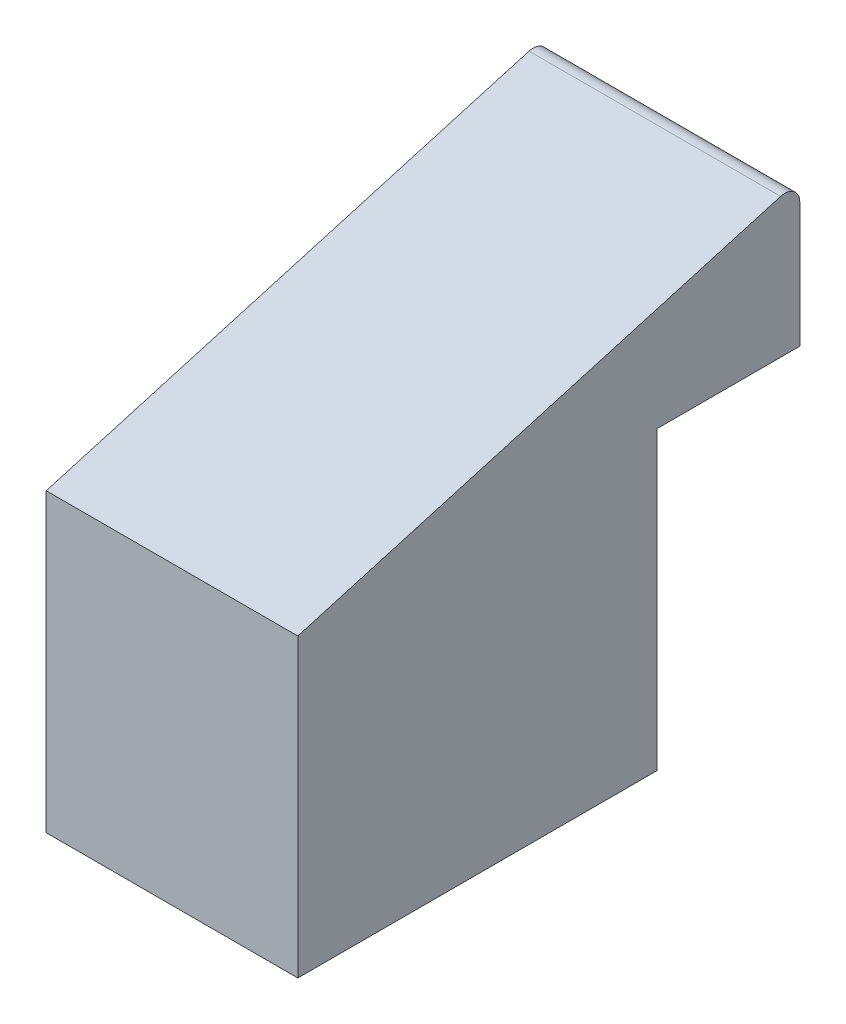
ISO-10303-21;
HEADER;
FILE_DESCRIPTION(('STEP AP214'),'2;1');
FILE_NAME('part.step','',(''),(''),'','','');
FILE_SCHEMA(('AUTOMOTIVE_DESIGN { 1 0 10303 214 1 1 1 1 }'));
ENDSEC;
DATA;
#1=APPLICATION_CONTEXT('core data for automotive mechanical design processes');
#2=APPLICATION_PROTOCOL_DEFINITION('international standard','automotive_design',2000,#1);
#3=PRODUCT_CONTEXT('',#1,'mechanical');
#4=PRODUCT('Part','Part','',(#3));
#5=PRODUCT_RELATED_PRODUCT_CATEGORY('part','',(#4));
#6=PRODUCT_DEFINITION_FORMATION('','',#4);
#7=PRODUCT_DEFINITION_CONTEXT('part definition',#1,'design');
#8=PRODUCT_DEFINITION('design','',#6,#7);
#9=PRODUCT_DEFINITION_SHAPE('','',#8);
#10=(LENGTH_UNIT() NAMED_UNIT(*) SI_UNIT(.MILLI.,.METRE.));
#11=(NAMED_UNIT(*) PLANE_ANGLE_UNIT() SI_UNIT($,.RADIAN.));
#12=(NAMED_UNIT(*) SI_UNIT($,.STERADIAN.) SOLID_ANGLE_UNIT());
#13=UNCERTAINTY_MEASURE_WITH_UNIT(LENGTH_MEASURE(1.E-05),#10,'distance_accuracy_value','');
#14=(GEOMETRIC_REPRESENTATION_CONTEXT(3) GLOBAL_UNCERTAINTY_ASSIGNED_CONTEXT((#13)) GLOBAL_UNIT_ASSIGNED_CONTEXT((#10,
#11,#12)) REPRESENTATION_CONTEXT('',''));
#15=CARTESIAN_POINT('',(0.,0.,0.));
#16=DIRECTION('',(0.,0.,1.));
#17=DIRECTION('',(1.,0.,0.));
#18=AXIS2_PLACEMENT_3D('',#15,#16,#17);
#19=CARTESIAN_POINT('',(9.60524066896878,-12.8758220709134,13.362378783161));
#20=DIRECTION('',(0.,0.,1.));
#21=DIRECTION('',(1.,0.,0.));
#22=AXIS2_PLACEMENT_3D('',#19,#20,#21);
#23=PLANE('',#22);
#24=DIRECTION('',(0.,-1.,0.));
#25=VECTOR('',#24,1.);
#26=CARTESIAN_POINT('',(9.85924066896878,-12.8758220709134,13.362378783161));
#27=LINE('',#26,#25);
#28=CARTESIAN_POINT('',(9.85924066896878,-12.8758220709134,13.362378783161));
#29=VERTEX_POINT('',#28);
#30=CARTESIAN_POINT('',(9.85924066896878,-15.3881327229248,13.362378783161));
#31=VERTEX_POINT('',#30);
#32=EDGE_CURVE('E66',#29,#31,#27,.T.);
#33=ORIENTED_EDGE('',*,*,#32,.T.);
#34=DIRECTION('',(1.,0.,0.));
#35=VECTOR('',#34,1.);
#36=CARTESIAN_POINT('',(-18.7402642661104,-15.3881327229248,13.362378783161));
#37=LINE('',#36,#35);
#38=CARTESIAN_POINT('',(9.60524066896878,-15.3881327229248,13.362378783161));
#39=VERTEX_POINT('',#38);
#40=EDGE_CURVE('E147',#39,#31,#37,.T.);
#41=ORIENTED_EDGE('',*,*,#40,.F.);
#42=DIRECTION('',(0.,-1.,0.));
#43=VECTOR('',#42,1.);
#44=CARTESIAN_POINT('',(9.60524066896878,-12.8758220709134,13.362378783161));
#45=LINE('',#44,#43);
#46=CARTESIAN_POINT('',(9.60524066896878,-12.8758220709134,13.362378783161));
#47=VERTEX_POINT('',#46);
#48=EDGE_CURVE('E164',#47,#39,#45,.T.);
#49=ORIENTED_EDGE('',*,*,#48,.F.);
#50=DIRECTION('',(-1.,0.,0.));
#51=VECTOR('',#50,1.);
#52=CARTESIAN_POINT('',(9.60524066896878,-12.8758220709134,13.362378783161));
#53=LINE('',#52,#51);
#54=EDGE_CURVE('E163',#29,#47,#53,.T.);
#55=ORIENTED_EDGE('',*,*,#54,.F.);
#56=EDGE_LOOP('',(#33,#41,#49,#55));
#57=FACE_BOUND('',#56,.T.);
#58=ADVANCED_FACE('F41',(#57),#23,.F.);
#59=CARTESIAN_POINT('',(5.18492778377403,-12.8758220709134,12.1523689889276));
#60=DIRECTION('',(0.,0.,-1.));
#61=DIRECTION('',(-1.,0.,0.));
#62=AXIS2_PLACEMENT_3D('',#59,#60,#61);
#63=PLANE('',#62);
#64=DIRECTION('',(1.,0.,0.));
#65=VECTOR('',#64,1.);
#66=CARTESIAN_POINT('',(5.18492778377403,-11.9115475959494,12.1523689889276));
#67=LINE('',#66,#65);
#68=CARTESIAN_POINT('',(9.85924066896878,-11.9115475959494,12.1523689889276));
#69=VERTEX_POINT('',#68);
#70=CARTESIAN_POINT('',(11.4857357338896,-11.9115475959494,12.1523689889276));
#71=VERTEX_POINT('',#70);
#72=EDGE_CURVE('E233',#69,#71,#67,.T.);
#73=ORIENTED_EDGE('',*,*,#72,.F.);
#74=DIRECTION('',(0.,-1.,0.));
#75=VECTOR('',#74,1.);
#76=CARTESIAN_POINT('',(9.85924066896878,-12.8758220709134,12.1523689889276));
#77=LINE('',#76,#75);
#78=CARTESIAN_POINT('',(9.85924066896878,-12.8758220709134,12.1523689889276));
#79=VERTEX_POINT('',#78);
#80=EDGE_CURVE('E237',#69,#79,#77,.T.);
#81=ORIENTED_EDGE('',*,*,#80,.T.);
#82=DIRECTION('',(1.,0.,0.));
#83=VECTOR('',#82,1.);
#84=CARTESIAN_POINT('',(5.18492778377403,-12.8758220709134,12.1523689889276));
#85=LINE('',#84,#83);
#86=CARTESIAN_POINT('',(9.60524066896878,-12.8758220709134,12.1523689889276));
#87=VERTEX_POINT('',#86);
#88=EDGE_CURVE('E187',#87,#79,#85,.T.);
#89=ORIENTED_EDGE('',*,*,#88,.F.);
#90=DIRECTION('',(0.,-1.,0.));
#91=VECTOR('',#90,1.);
#92=CARTESIAN_POINT('',(9.60524066896878,-12.8758220709134,12.1523689889276));
#93=LINE('',#92,#91);
#94=CARTESIAN_POINT('',(9.60524066896878,-11.8160118100752,12.1523689889276));
#95=VERTEX_POINT('',#94);
#96=EDGE_CURVE('E198',#95,#87,#93,.T.);
#97=ORIENTED_EDGE('',*,*,#96,.F.);
#98=DIRECTION('',(1.,0.,0.));
#99=VECTOR('',#98,1.);
#100=CARTESIAN_POINT('',(5.18492778377403,-11.8160118100752,12.1523689889276));
#101=LINE('',#100,#99);
#102=CARTESIAN_POINT('',(11.7397357338896,-11.8160118100752,12.1523689889276));
#103=VERTEX_POINT('',#102);
#104=EDGE_CURVE('E191',#95,#103,#101,.T.);
#105=ORIENTED_EDGE('',*,*,#104,.T.);
#106=DIRECTION('',(0.,1.,0.));
#107=VECTOR('',#106,1.);
#108=CARTESIAN_POINT('',(11.7397357338896,-12.8758220709134,12.1523689889276));
#109=LINE('',#108,#107);
#110=CARTESIAN_POINT('',(11.7397357338896,-12.8758220709134,12.1523689889276));
#111=VERTEX_POINT('',#110);
#112=EDGE_CURVE('E203',#111,#103,#109,.T.);
#113=ORIENTED_EDGE('',*,*,#112,.F.);
#114=CARTESIAN_POINT('',(11.4857357338896,-12.8758220709134,12.1523689889276));
#115=VERTEX_POINT('',#114);
#116=EDGE_CURVE('E192',#115,#111,#85,.T.);
#117=ORIENTED_EDGE('',*,*,#116,.F.);
#118=DIRECTION('',(0.,1.,0.));
#119=VECTOR('',#118,1.);
#120=CARTESIAN_POINT('',(11.4857357338896,-12.8758220709134,12.1523689889276));
#121=LINE('',#120,#119);
#122=EDGE_CURVE('E228',#115,#71,#121,.T.);
#123=ORIENTED_EDGE('',*,*,#122,.T.);
#124=EDGE_LOOP('',(#73,#81,#89,#97,#105,#113,#117,#123));
#125=FACE_BOUND('',#124,.T.);
#126=ADVANCED_FACE('F294',(#125),#63,.T.);
#127=CARTESIAN_POINT('',(5.18492778377403,-12.8758220709134,16.410378783161));
#128=DIRECTION('',(0.,-1.,0.));
#129=DIRECTION('',(0.,0.,-1.));
#130=AXIS2_PLACEMENT_3D('',#127,#128,#129);
#131=PLANE('',#130);
#132=CARTESIAN_POINT('',(11.7397357338896,-12.8758220709134,13.362378783161));
#133=VERTEX_POINT('',#132);
#134=CARTESIAN_POINT('',(11.4857357338896,-12.8758220709134,13.362378783161));
#135=VERTEX_POINT('',#134);
#136=EDGE_CURVE('E160',#133,#135,#53,.T.);
#137=ORIENTED_EDGE('',*,*,#136,.T.);
#138=DIRECTION('',(0.,0.,-1.));
#139=VECTOR('',#138,1.);
#140=CARTESIAN_POINT('',(11.4857357338896,-12.8758220709134,16.410378783161));
#141=LINE('',#140,#139);
#142=EDGE_CURVE('E225',#135,#115,#141,.T.);
#143=ORIENTED_EDGE('',*,*,#142,.T.);
#144=ORIENTED_EDGE('',*,*,#116,.T.);
#145=DIRECTION('',(0.,0.,-1.));
#146=VECTOR('',#145,1.);
#147=CARTESIAN_POINT('',(11.7397357338896,-12.8758220709134,16.410378783161));
#148=LINE('',#147,#146);
#149=EDGE_CURVE('E207',#133,#111,#148,.T.);
#150=ORIENTED_EDGE('',*,*,#149,.F.);
#151=EDGE_LOOP('',(#137,#143,#144,#150));
#152=FACE_BOUND('',#151,.T.);
#153=ADVANCED_FACE('F306',(#152),#131,.T.);
#154=ORIENTED_EDGE('',*,*,#88,.T.);
#155=DIRECTION('',(0.,0.,1.));
#156=VECTOR('',#155,1.);
#157=CARTESIAN_POINT('',(9.85924066896878,-12.8758220709134,16.410378783161));
#158=LINE('',#157,#156);
#159=EDGE_CURVE('E242',#79,#29,#158,.T.);
#160=ORIENTED_EDGE('',*,*,#159,.T.);
#161=ORIENTED_EDGE('',*,*,#54,.T.);
#162=DIRECTION('',(0.,0.,1.));
#163=VECTOR('',#162,1.);
#164=CARTESIAN_POINT('',(9.60524066896878,-12.8758220709134,16.410378783161));
#165=LINE('',#164,#163);
#166=EDGE_CURVE('E169',#87,#47,#165,.T.);
#167=ORIENTED_EDGE('',*,*,#166,.F.);
#168=EDGE_LOOP('',(#154,#160,#161,#167));
#169=FACE_BOUND('',#168,.T.);
#170=ADVANCED_FACE('F290',(#169),#131,.T.);
#171=CARTESIAN_POINT('',(9.60524066896878,-12.8758220709134,16.410378783161));
#172=DIRECTION('',(1.,0.,0.));
#173=DIRECTION('',(0.,0.,-1.));
#174=AXIS2_PLACEMENT_3D('',#171,#172,#173);
#175=PLANE('',#174);
#176=ORIENTED_EDGE('',*,*,#48,.T.);
#177=DIRECTION('',(0.,0.,1.));
#178=VECTOR('',#177,1.);
#179=CARTESIAN_POINT('',(9.60524066896878,-15.3881327229248,16.410378783161));
#180=LINE('',#179,#178);
#181=CARTESIAN_POINT('',(9.60524066896878,-15.3881327229248,16.410378783161));
#182=VERTEX_POINT('',#181);
#183=EDGE_CURVE('E265',#39,#182,#180,.T.);
#184=ORIENTED_EDGE('',*,*,#183,.T.);
#185=DIRECTION('',(0.,-1.,0.));
#186=VECTOR('',#185,1.);
#187=CARTESIAN_POINT('',(9.60524066896878,-12.8758220709134,16.410378783161));
#188=LINE('',#187,#186);
#189=CARTESIAN_POINT('',(9.60524066896878,-12.8758220709134,16.410378783161));
#190=VERTEX_POINT('',#189);
#191=EDGE_CURVE('E172',#190,#182,#188,.T.);
#192=ORIENTED_EDGE('',*,*,#191,.F.);
#193=DIRECTION('',(0.,0.277236683123786,-0.960801655665997));
#194=VECTOR('',#193,1.);
#195=CARTESIAN_POINT('',(9.60524066896878,-11.6939899998057,12.3145780476843));
#196=LINE('',#195,#194);
#197=CARTESIAN_POINT('',(9.60524066896878,-11.6939899998057,12.3145780476843));
#198=VERTEX_POINT('',#197);
#199=EDGE_CURVE('E186',#190,#198,#196,.T.);
#200=ORIENTED_EDGE('',*,*,#199,.T.);
#201=CARTESIAN_POINT('',(9.60524066896878,-11.8160118100752,12.2793689889276));
#202=DIRECTION('',(1.,0.,0.));
#203=DIRECTION('',(0.,0.,-1.));
#204=AXIS2_PLACEMENT_3D('',#201,#202,#203);
#205=CIRCLE('',#204,0.127);
#206=EDGE_CURVE('E216',#198,#95,#205,.F.);
#207=ORIENTED_EDGE('',*,*,#206,.T.);
#208=ORIENTED_EDGE('',*,*,#96,.T.);
#209=ORIENTED_EDGE('',*,*,#166,.T.);
#210=EDGE_LOOP('',(#176,#184,#192,#200,#207,#208,#209));
#211=FACE_BOUND('',#210,.T.);
#212=ADVANCED_FACE('F43',(#211),#175,.F.);
#213=CARTESIAN_POINT('',(11.7397357338896,-12.8758220709134,16.410378783161));
#214=DIRECTION('',(-1.,0.,0.));
#215=DIRECTION('',(0.,0.,1.));
#216=AXIS2_PLACEMENT_3D('',#213,#214,#215);
#217=PLANE('',#216);
#218=DIRECTION('',(0.,1.,0.));
#219=VECTOR('',#218,1.);
#220=CARTESIAN_POINT('',(11.7397357338896,-12.8758220709134,16.410378783161));
#221=LINE('',#220,#219);
#222=CARTESIAN_POINT('',(11.7397357338896,-15.3881327229248,16.410378783161));
#223=VERTEX_POINT('',#222);
#224=CARTESIAN_POINT('',(11.7397357338896,-12.8758220709134,16.410378783161));
#225=VERTEX_POINT('',#224);
#226=EDGE_CURVE('E51',#223,#225,#221,.T.);
#227=ORIENTED_EDGE('',*,*,#226,.F.);
#228=DIRECTION('',(0.,0.,1.));
#229=VECTOR('',#228,1.);
#230=CARTESIAN_POINT('',(11.7397357338896,-15.3881327229248,13.362378783161));
#231=LINE('',#230,#229);
#232=CARTESIAN_POINT('',(11.7397357338896,-15.3881327229248,13.362378783161));
#233=VERTEX_POINT('',#232);
#234=EDGE_CURVE('E139',#233,#223,#231,.T.);
#235=ORIENTED_EDGE('',*,*,#234,.F.);
#236=DIRECTION('',(0.,1.,0.));
#237=VECTOR('',#236,1.);
#238=CARTESIAN_POINT('',(11.7397357338896,-12.8758220709134,13.362378783161));
#239=LINE('',#238,#237);
#240=EDGE_CURVE('E153',#233,#133,#239,.T.);
#241=ORIENTED_EDGE('',*,*,#240,.T.);
#242=ORIENTED_EDGE('',*,*,#149,.T.);
#243=ORIENTED_EDGE('',*,*,#112,.T.);
#244=CARTESIAN_POINT('',(11.7397357338896,-11.8160118100752,12.2793689889276));
#245=DIRECTION('',(1.,0.,0.));
#246=DIRECTION('',(0.,0.,-1.));
#247=AXIS2_PLACEMENT_3D('',#244,#245,#246);
#248=CIRCLE('',#247,0.127);
#249=CARTESIAN_POINT('',(11.7397357338896,-11.6939899998057,12.3145780476843));
#250=VERTEX_POINT('',#249);
#251=EDGE_CURVE('E199',#103,#250,#248,.T.);
#252=ORIENTED_EDGE('',*,*,#251,.T.);
#253=DIRECTION('',(0.,-0.277236683123786,0.960801655665997));
#254=VECTOR('',#253,1.);
#255=CARTESIAN_POINT('',(11.7397357338896,-11.6939899998057,12.3145780476843));
#256=LINE('',#255,#254);
#257=EDGE_CURVE('E210',#250,#225,#256,.T.);
#258=ORIENTED_EDGE('',*,*,#257,.T.);
#259=EDGE_LOOP('',(#227,#235,#241,#242,#243,#252,#258));
#260=FACE_BOUND('',#259,.T.);
#261=ADVANCED_FACE('F151',(#260),#217,.F.);
#262=CARTESIAN_POINT('',(9.60524066896878,-12.8758220709134,16.410378783161));
#263=DIRECTION('',(0.,0.,1.));
#264=DIRECTION('',(1.,0.,0.));
#265=AXIS2_PLACEMENT_3D('',#262,#263,#264);
#266=PLANE('',#265);
#267=DIRECTION('',(1.,0.,0.));
#268=VECTOR('',#267,1.);
#269=CARTESIAN_POINT('',(-18.7402642661104,-15.3881327229248,16.410378783161));
#270=LINE('',#269,#268);
#271=EDGE_CURVE('E276',#182,#223,#270,.T.);
#272=ORIENTED_EDGE('',*,*,#271,.T.);
#273=ORIENTED_EDGE('',*,*,#226,.T.);
#274=DIRECTION('',(-1.,0.,0.));
#275=VECTOR('',#274,1.);
#276=CARTESIAN_POINT('',(9.60524066896878,-12.8758220709134,16.410378783161));
#277=LINE('',#276,#275);
#278=EDGE_CURVE('E11',#225,#190,#277,.T.);
#279=ORIENTED_EDGE('',*,*,#278,.T.);
#280=ORIENTED_EDGE('',*,*,#191,.T.);
#281=EDGE_LOOP('',(#272,#273,#279,#280));
#282=FACE_BOUND('',#281,.T.);
#283=ADVANCED_FACE('F320',(#282),#266,.T.);
#284=ORIENTED_EDGE('',*,*,#240,.F.);
#285=CARTESIAN_POINT('',(11.4857357338896,-15.3881327229248,13.362378783161));
#286=VERTEX_POINT('',#285);
#287=EDGE_CURVE('E136',#286,#233,#37,.T.);
#288=ORIENTED_EDGE('',*,*,#287,.F.);
#289=DIRECTION('',(0.,1.,0.));
#290=VECTOR('',#289,1.);
#291=CARTESIAN_POINT('',(11.4857357338896,-12.8758220709134,13.362378783161));
#292=LINE('',#291,#290);
#293=EDGE_CURVE('E221',#286,#135,#292,.T.);
#294=ORIENTED_EDGE('',*,*,#293,.T.);
#295=ORIENTED_EDGE('',*,*,#136,.F.);
#296=EDGE_LOOP('',(#284,#288,#294,#295));
#297=FACE_BOUND('',#296,.T.);
#298=ADVANCED_FACE('F158',(#297),#23,.F.);
#299=CARTESIAN_POINT('',(5.18492778377403,-11.6939899998057,12.3145780476843));
#300=DIRECTION('',(0.,0.960801655665997,0.277236683123786));
#301=DIRECTION('',(0.,-0.277236683123786,0.960801655665997));
#302=AXIS2_PLACEMENT_3D('',#299,#300,#301);
#303=PLANE('',#302);
#304=ORIENTED_EDGE('',*,*,#199,.F.);
#305=ORIENTED_EDGE('',*,*,#278,.F.);
#306=ORIENTED_EDGE('',*,*,#257,.F.);
#307=DIRECTION('',(1.,0.,0.));
#308=VECTOR('',#307,1.);
#309=CARTESIAN_POINT('',(5.18492778377403,-11.6939899998057,12.3145780476843));
#310=LINE('',#309,#308);
#311=EDGE_CURVE('E195',#198,#250,#310,.T.);
#312=ORIENTED_EDGE('',*,*,#311,.F.);
#313=EDGE_LOOP('',(#304,#305,#306,#312));
#314=FACE_BOUND('',#313,.T.);
#315=ADVANCED_FACE('F319',(#314),#303,.T.);
#316=CARTESIAN_POINT('',(5.18492778377403,-11.8160118100752,12.2793689889276));
#317=DIRECTION('',(1.,0.,0.));
#318=DIRECTION('',(0.,0.,-1.));
#319=AXIS2_PLACEMENT_3D('',#316,#317,#318);
#320=CYLINDRICAL_SURFACE('',#319,0.127);
#321=ORIENTED_EDGE('',*,*,#206,.F.);
#322=ORIENTED_EDGE('',*,*,#311,.T.);
#323=ORIENTED_EDGE('',*,*,#251,.F.);
#324=ORIENTED_EDGE('',*,*,#104,.F.);
#325=EDGE_LOOP('',(#321,#322,#323,#324));
#326=FACE_BOUND('',#325,.T.);
#327=ADVANCED_FACE('F313',(#326),#320,.T.);
#328=CARTESIAN_POINT('',(9.85924066896878,-12.8758220709134,16.410378783161));
#329=DIRECTION('',(1.,0.,0.));
#330=DIRECTION('',(0.,0.,-1.));
#331=AXIS2_PLACEMENT_3D('',#328,#329,#330);
#332=PLANE('',#331);
#333=DIRECTION('',(0.,0.,1.));
#334=VECTOR('',#333,1.);
#335=CARTESIAN_POINT('',(9.85924066896878,-15.3881327229248,16.410378783161));
#336=LINE('',#335,#334);
#337=CARTESIAN_POINT('',(9.85924066896878,-15.3881327229248,16.156378783161));
#338=VERTEX_POINT('',#337);
#339=EDGE_CURVE('E59',#31,#338,#336,.T.);
#340=ORIENTED_EDGE('',*,*,#339,.F.);
#341=ORIENTED_EDGE('',*,*,#32,.F.);
#342=ORIENTED_EDGE('',*,*,#159,.F.);
#343=ORIENTED_EDGE('',*,*,#80,.F.);
#344=DIRECTION('',(0.,0.277236683123786,-0.960801655665997));
#345=VECTOR('',#344,1.);
#346=CARTESIAN_POINT('',(9.85924066896878,-11.9380336203448,12.2441599301708));
#347=LINE('',#346,#345);
#348=CARTESIAN_POINT('',(9.85924066896878,-13.0668936426618,16.156378783161));
#349=VERTEX_POINT('',#348);
#350=EDGE_CURVE('E241',#349,#69,#347,.T.);
#351=ORIENTED_EDGE('',*,*,#350,.F.);
#352=DIRECTION('',(0.,-1.,0.));
#353=VECTOR('',#352,1.);
#354=CARTESIAN_POINT('',(9.85924066896878,-12.8758220709134,16.156378783161));
#355=LINE('',#354,#353);
#356=EDGE_CURVE('E224',#349,#338,#355,.T.);
#357=ORIENTED_EDGE('',*,*,#356,.T.);
#358=EDGE_LOOP('',(#340,#341,#342,#343,#351,#357));
#359=FACE_BOUND('',#358,.T.);
#360=ADVANCED_FACE('F284',(#359),#332,.T.);
#361=CARTESIAN_POINT('',(11.4857357338896,-12.8758220709134,16.410378783161));
#362=DIRECTION('',(-1.,0.,0.));
#363=DIRECTION('',(0.,0.,1.));
#364=AXIS2_PLACEMENT_3D('',#361,#362,#363);
#365=PLANE('',#364);
#366=DIRECTION('',(0.,0.,-1.));
#367=VECTOR('',#366,1.);
#368=CARTESIAN_POINT('',(11.4857357338896,-15.3881327229248,16.410378783161));
#369=LINE('',#368,#367);
#370=CARTESIAN_POINT('',(11.4857357338896,-15.3881327229248,16.156378783161));
#371=VERTEX_POINT('',#370);
#372=EDGE_CURVE('E142',#371,#286,#369,.T.);
#373=ORIENTED_EDGE('',*,*,#372,.F.);
#374=DIRECTION('',(0.,1.,0.));
#375=VECTOR('',#374,1.);
#376=CARTESIAN_POINT('',(11.4857357338896,-12.8758220709134,16.156378783161));
#377=LINE('',#376,#375);
#378=CARTESIAN_POINT('',(11.4857357338896,-13.0668936426618,16.156378783161));
#379=VERTEX_POINT('',#378);
#380=EDGE_CURVE('E253',#371,#379,#377,.T.);
#381=ORIENTED_EDGE('',*,*,#380,.T.);
#382=DIRECTION('',(0.,-0.277236683123786,0.960801655665997));
#383=VECTOR('',#382,1.);
#384=CARTESIAN_POINT('',(11.4857357338896,-11.9380336203448,12.2441599301708));
#385=LINE('',#384,#383);
#386=EDGE_CURVE('E229',#71,#379,#385,.T.);
#387=ORIENTED_EDGE('',*,*,#386,.F.);
#388=ORIENTED_EDGE('',*,*,#122,.F.);
#389=ORIENTED_EDGE('',*,*,#142,.F.);
#390=ORIENTED_EDGE('',*,*,#293,.F.);
#391=EDGE_LOOP('',(#373,#381,#387,#388,#389,#390));
#392=FACE_BOUND('',#391,.T.);
#393=ADVANCED_FACE('F304',(#392),#365,.T.);
#394=CARTESIAN_POINT('',(9.60524066896878,-12.8758220709134,16.156378783161));
#395=DIRECTION('',(0.,0.,1.));
#396=DIRECTION('',(1.,0.,0.));
#397=AXIS2_PLACEMENT_3D('',#394,#395,#396);
#398=PLANE('',#397);
#399=ORIENTED_EDGE('',*,*,#380,.F.);
#400=DIRECTION('',(-1.,0.,0.));
#401=VECTOR('',#400,1.);
#402=CARTESIAN_POINT('',(9.60524066896878,-15.3881327229248,16.156378783161));
#403=LINE('',#402,#401);
#404=EDGE_CURVE('E273',#371,#338,#403,.T.);
#405=ORIENTED_EDGE('',*,*,#404,.T.);
#406=ORIENTED_EDGE('',*,*,#356,.F.);
#407=DIRECTION('',(-1.,0.,0.));
#408=VECTOR('',#407,1.);
#409=CARTESIAN_POINT('',(9.60524066896878,-13.0668936426618,16.156378783161));
#410=LINE('',#409,#408);
#411=EDGE_CURVE('E213',#379,#349,#410,.T.);
#412=ORIENTED_EDGE('',*,*,#411,.F.);
#413=EDGE_LOOP('',(#399,#405,#406,#412));
#414=FACE_BOUND('',#413,.T.);
#415=ADVANCED_FACE('F302',(#414),#398,.F.);
#416=CARTESIAN_POINT('',(5.18492778377403,-11.9380336203448,12.2441599301708));
#417=DIRECTION('',(0.,0.960801655665997,0.277236683123786));
#418=DIRECTION('',(0.,-0.277236683123786,0.960801655665997));
#419=AXIS2_PLACEMENT_3D('',#416,#417,#418);
#420=PLANE('',#419);
#421=CARTESIAN_POINT('',(10.6724882014292,-12.7183754249117,14.9485412168221));
#422=DIRECTION('',(0.,0.960801655665997,0.277236683123786));
#423=DIRECTION('',(0.,-0.277236683123786,0.960801655665997));
#424=AXIS2_PLACEMENT_3D('',#421,#422,#423);
#425=ELLIPSE('',#424,0.342907174104073,0.329465780618942);
#426=CARTESIAN_POINT('',(10.6724882014292,-12.8134418724797,15.278006997441));
#427=VERTEX_POINT('',#426);
#428=EDGE_CURVE('E250',#427,#427,#425,.F.);
#429=ORIENTED_EDGE('',*,*,#428,.F.);
#430=EDGE_LOOP('',(#429));
#431=FACE_BOUND('',#430,.T.);
#432=ORIENTED_EDGE('',*,*,#350,.T.);
#433=ORIENTED_EDGE('',*,*,#72,.T.);
#434=ORIENTED_EDGE('',*,*,#386,.T.);
#435=ORIENTED_EDGE('',*,*,#411,.T.);
#436=EDGE_LOOP('',(#432,#433,#434,#435));
#437=FACE_BOUND('',#436,.T.);
#438=ADVANCED_FACE('F298',(#431,#437),#420,.F.);
#439=CARTESIAN_POINT('',(10.6724882014292,-11.7674964733695,14.9485412168221));
#440=DIRECTION('',(0.,-1.,0.));
#441=DIRECTION('',(0.,0.,-1.));
#442=AXIS2_PLACEMENT_3D('',#439,#440,#441);
#443=CYLINDRICAL_SURFACE('',#442,0.329465780618942);
#444=CARTESIAN_POINT('',(10.6724882014292,-15.3881327229248,14.9485412168221));
#445=DIRECTION('',(0.,1.,0.));
#446=DIRECTION('',(0.,0.,1.));
#447=AXIS2_PLACEMENT_3D('',#444,#445,#446);
#448=CIRCLE('',#447,0.329465780618942);
#449=CARTESIAN_POINT('',(10.6724882014292,-15.3881327229248,15.278006997441));
#450=VERTEX_POINT('',#449);
#451=EDGE_CURVE('E45',#450,#450,#448,.F.);
#452=ORIENTED_EDGE('',*,*,#451,.F.);
#453=EDGE_LOOP('',(#452));
#454=FACE_BOUND('',#453,.T.);
#455=ORIENTED_EDGE('',*,*,#428,.T.);
#456=EDGE_LOOP('',(#455));
#457=FACE_BOUND('',#456,.T.);
#458=ADVANCED_FACE('F349',(#454,#457),#443,.T.);
#459=CARTESIAN_POINT('',(-18.7402642661104,-15.3881327229248,13.362378783161));
#460=DIRECTION('',(0.,1.,0.));
#461=DIRECTION('',(0.,0.,1.));
#462=AXIS2_PLACEMENT_3D('',#459,#460,#461);
#463=PLANE('',#462);
#464=ORIENTED_EDGE('',*,*,#451,.T.);
#465=EDGE_LOOP('',(#464));
#466=FACE_BOUND('',#465,.T.);
#467=ADVANCED_FACE('F359',(#466),#463,.F.);
#468=ORIENTED_EDGE('',*,*,#40,.T.);
#469=ORIENTED_EDGE('',*,*,#339,.T.);
#470=ORIENTED_EDGE('',*,*,#404,.F.);
#471=ORIENTED_EDGE('',*,*,#372,.T.);
#472=ORIENTED_EDGE('',*,*,#287,.T.);
#473=ORIENTED_EDGE('',*,*,#234,.T.);
#474=ORIENTED_EDGE('',*,*,#271,.F.);
#475=ORIENTED_EDGE('',*,*,#183,.F.);
#476=EDGE_LOOP('',(#468,#469,#470,#471,#472,#473,#474,#475));
#477=FACE_BOUND('',#476,.T.);
#478=ADVANCED_FACE('F138',(#477),#463,.F.);
#479=CLOSED_SHELL('',(#58,#126,#153,#170,#212,#261,#283,#298,#315,#327,#360,#393,#415,#438,#458,
#467,#478));
#480=MANIFOLD_SOLID_BREP('B2',#479);
#481=ADVANCED_BREP_SHAPE_REPRESENTATION('',(#18,#480),#14);
#482=SHAPE_DEFINITION_REPRESENTATION(#9,#481);
ENDSEC;
END-ISO-10303-21;
